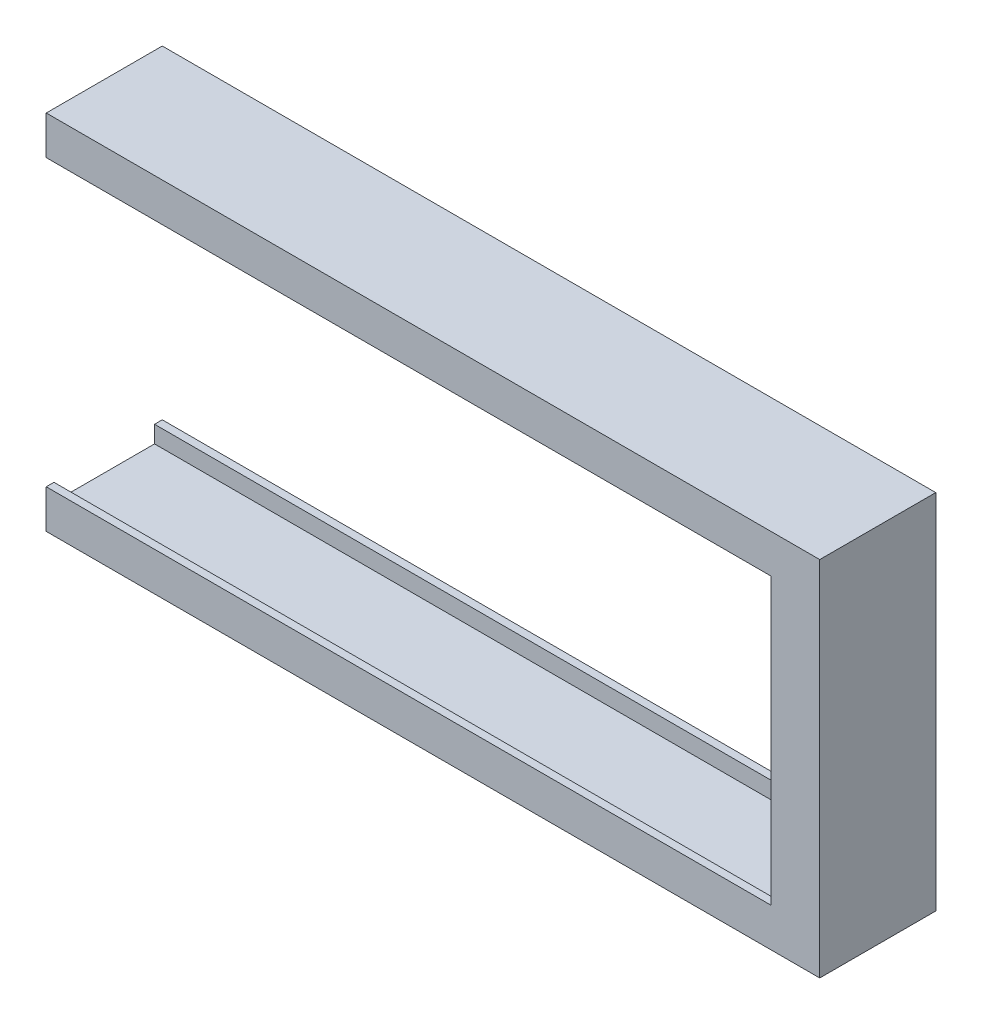
ISO-10303-21;
HEADER;
FILE_DESCRIPTION(('STEP AP214'),'2;1');
FILE_NAME('part.step','',(''),(''),'','','');
FILE_SCHEMA(('AUTOMOTIVE_DESIGN { 1 0 10303 214 1 1 1 1 }'));
ENDSEC;
DATA;
#1=APPLICATION_CONTEXT('core data for automotive mechanical design processes');
#2=APPLICATION_PROTOCOL_DEFINITION('international standard','automotive_design',2000,#1);
#3=PRODUCT_CONTEXT('',#1,'mechanical');
#4=PRODUCT('Part','Part','',(#3));
#5=PRODUCT_RELATED_PRODUCT_CATEGORY('part','',(#4));
#6=PRODUCT_DEFINITION_FORMATION('','',#4);
#7=PRODUCT_DEFINITION_CONTEXT('part definition',#1,'design');
#8=PRODUCT_DEFINITION('design','',#6,#7);
#9=PRODUCT_DEFINITION_SHAPE('','',#8);
#10=(LENGTH_UNIT() NAMED_UNIT(*) SI_UNIT(.MILLI.,.METRE.));
#11=(NAMED_UNIT(*) PLANE_ANGLE_UNIT() SI_UNIT($,.RADIAN.));
#12=(NAMED_UNIT(*) SI_UNIT($,.STERADIAN.) SOLID_ANGLE_UNIT());
#13=UNCERTAINTY_MEASURE_WITH_UNIT(LENGTH_MEASURE(1.E-05),#10,'distance_accuracy_value','');
#14=(GEOMETRIC_REPRESENTATION_CONTEXT(3) GLOBAL_UNCERTAINTY_ASSIGNED_CONTEXT((#13)) GLOBAL_UNIT_ASSIGNED_CONTEXT((#10,
#11,#12)) REPRESENTATION_CONTEXT('',''));
#15=CARTESIAN_POINT('',(0.,0.,0.));
#16=DIRECTION('',(0.,0.,1.));
#17=DIRECTION('',(1.,0.,0.));
#18=AXIS2_PLACEMENT_3D('',#15,#16,#17);
#19=CARTESIAN_POINT('',(-127.,-59.4995,-38.1));
#20=DIRECTION('',(-1.,0.,0.));
#21=DIRECTION('',(0.,0.,1.));
#22=AXIS2_PLACEMENT_3D('',#19,#20,#21);
#23=PLANE('',#22);
#24=DIRECTION('',(0.,0.,1.));
#25=VECTOR('',#24,1.);
#26=CARTESIAN_POINT('',(-127.,46.7995,-38.354));
#27=LINE('',#26,#25);
#28=CARTESIAN_POINT('',(-127.,46.7995,-2.54000000000001));
#29=VERTEX_POINT('',#28);
#30=CARTESIAN_POINT('',(-127.,46.7995,0.));
#31=VERTEX_POINT('',#30);
#32=EDGE_CURVE('E160',#29,#31,#27,.T.);
#33=ORIENTED_EDGE('',*,*,#32,.T.);
#34=DIRECTION('',(0.,-1.,0.));
#35=VECTOR('',#34,1.);
#36=CARTESIAN_POINT('',(-127.,-59.4995,0.));
#37=LINE('',#36,#35);
#38=CARTESIAN_POINT('',(-127.,59.4995,0.));
#39=VERTEX_POINT('',#38);
#40=EDGE_CURVE('E173',#39,#31,#37,.T.);
#41=ORIENTED_EDGE('',*,*,#40,.F.);
#42=DIRECTION('',(0.,0.,1.));
#43=VECTOR('',#42,1.);
#44=CARTESIAN_POINT('',(-127.,59.4995,-38.1));
#45=LINE('',#44,#43);
#46=CARTESIAN_POINT('',(-127.,59.4995,-38.1));
#47=VERTEX_POINT('',#46);
#48=EDGE_CURVE('E205',#47,#39,#45,.T.);
#49=ORIENTED_EDGE('',*,*,#48,.F.);
#50=DIRECTION('',(0.,-1.,0.));
#51=VECTOR('',#50,1.);
#52=CARTESIAN_POINT('',(-127.,-59.4995,-38.1));
#53=LINE('',#52,#51);
#54=CARTESIAN_POINT('',(-127.,46.7995,-38.1));
#55=VERTEX_POINT('',#54);
#56=EDGE_CURVE('E312',#47,#55,#53,.T.);
#57=ORIENTED_EDGE('',*,*,#56,.T.);
#58=CARTESIAN_POINT('',(-127.,46.7995,-35.56));
#59=VERTEX_POINT('',#58);
#60=EDGE_CURVE('E178',#55,#59,#27,.T.);
#61=ORIENTED_EDGE('',*,*,#60,.T.);
#62=DIRECTION('',(0.,-1.,0.));
#63=VECTOR('',#62,1.);
#64=CARTESIAN_POINT('',(-127.,52.3875,-35.56));
#65=LINE('',#64,#63);
#66=CARTESIAN_POINT('',(-127.,52.3875,-35.56));
#67=VERTEX_POINT('',#66);
#68=EDGE_CURVE('E276',#67,#59,#65,.T.);
#69=ORIENTED_EDGE('',*,*,#68,.F.);
#70=DIRECTION('',(0.,0.,-1.));
#71=VECTOR('',#70,1.);
#72=CARTESIAN_POINT('',(-127.,52.3875,-35.56));
#73=LINE('',#72,#71);
#74=CARTESIAN_POINT('',(-127.,52.3875,-2.54000000000001));
#75=VERTEX_POINT('',#74);
#76=EDGE_CURVE('E263',#75,#67,#73,.T.);
#77=ORIENTED_EDGE('',*,*,#76,.F.);
#78=DIRECTION('',(0.,1.,0.));
#79=VECTOR('',#78,1.);
#80=CARTESIAN_POINT('',(-127.,52.3875,-2.54000000000001));
#81=LINE('',#80,#79);
#82=EDGE_CURVE('E176',#29,#75,#81,.T.);
#83=ORIENTED_EDGE('',*,*,#82,.F.);
#84=EDGE_LOOP('',(#33,#41,#49,#57,#61,#69,#77,#83));
#85=FACE_BOUND('',#84,.T.);
#86=ADVANCED_FACE('F44',(#85),#23,.T.);
#87=CARTESIAN_POINT('',(127.,-59.4995,-38.1));
#88=DIRECTION('',(1.,0.,0.));
#89=DIRECTION('',(0.,0.,-1.));
#90=AXIS2_PLACEMENT_3D('',#87,#88,#89);
#91=PLANE('',#90);
#92=DIRECTION('',(0.,1.,0.));
#93=VECTOR('',#92,1.);
#94=CARTESIAN_POINT('',(127.,-59.4995,0.));
#95=LINE('',#94,#93);
#96=CARTESIAN_POINT('',(127.,-59.4995,0.));
#97=VERTEX_POINT('',#96);
#98=CARTESIAN_POINT('',(127.,59.4995,0.));
#99=VERTEX_POINT('',#98);
#100=EDGE_CURVE('E293',#97,#99,#95,.T.);
#101=ORIENTED_EDGE('',*,*,#100,.F.);
#102=DIRECTION('',(0.,0.,1.));
#103=VECTOR('',#102,1.);
#104=CARTESIAN_POINT('',(127.,-59.4995,-38.1));
#105=LINE('',#104,#103);
#106=CARTESIAN_POINT('',(127.,-59.4995,-38.1));
#107=VERTEX_POINT('',#106);
#108=EDGE_CURVE('E197',#107,#97,#105,.T.);
#109=ORIENTED_EDGE('',*,*,#108,.F.);
#110=DIRECTION('',(0.,1.,0.));
#111=VECTOR('',#110,1.);
#112=CARTESIAN_POINT('',(127.,-59.4995,-38.1));
#113=LINE('',#112,#111);
#114=CARTESIAN_POINT('',(127.,59.4995,-38.1));
#115=VERTEX_POINT('',#114);
#116=EDGE_CURVE('E192',#107,#115,#113,.T.);
#117=ORIENTED_EDGE('',*,*,#116,.T.);
#118=DIRECTION('',(0.,0.,1.));
#119=VECTOR('',#118,1.);
#120=CARTESIAN_POINT('',(127.,59.4995,-38.1));
#121=LINE('',#120,#119);
#122=EDGE_CURVE('E208',#115,#99,#121,.T.);
#123=ORIENTED_EDGE('',*,*,#122,.T.);
#124=EDGE_LOOP('',(#101,#109,#117,#123));
#125=FACE_BOUND('',#124,.T.);
#126=ADVANCED_FACE('F46',(#125),#91,.T.);
#127=CARTESIAN_POINT('',(-127.,-59.4995,-38.1));
#128=DIRECTION('',(0.,-1.,0.));
#129=DIRECTION('',(0.,0.,-1.));
#130=AXIS2_PLACEMENT_3D('',#127,#128,#129);
#131=PLANE('',#130);
#132=DIRECTION('',(1.,0.,0.));
#133=VECTOR('',#132,1.);
#134=CARTESIAN_POINT('',(-127.,-59.4995,0.));
#135=LINE('',#134,#133);
#136=CARTESIAN_POINT('',(-127.,-59.4995,0.));
#137=VERTEX_POINT('',#136);
#138=EDGE_CURVE('E186',#137,#97,#135,.T.);
#139=ORIENTED_EDGE('',*,*,#138,.F.);
#140=DIRECTION('',(0.,0.,1.));
#141=VECTOR('',#140,1.);
#142=CARTESIAN_POINT('',(-127.,-59.4995,-38.1));
#143=LINE('',#142,#141);
#144=CARTESIAN_POINT('',(-127.,-59.4995,-38.1));
#145=VERTEX_POINT('',#144);
#146=EDGE_CURVE('E201',#145,#137,#143,.T.);
#147=ORIENTED_EDGE('',*,*,#146,.F.);
#148=DIRECTION('',(1.,0.,0.));
#149=VECTOR('',#148,1.);
#150=CARTESIAN_POINT('',(-127.,-59.4995,-38.1));
#151=LINE('',#150,#149);
#152=EDGE_CURVE('E211',#145,#107,#151,.T.);
#153=ORIENTED_EDGE('',*,*,#152,.T.);
#154=ORIENTED_EDGE('',*,*,#108,.T.);
#155=EDGE_LOOP('',(#139,#147,#153,#154));
#156=FACE_BOUND('',#155,.T.);
#157=ADVANCED_FACE('F359',(#156),#131,.T.);
#158=DIRECTION('',(0.,0.,1.));
#159=VECTOR('',#158,1.);
#160=CARTESIAN_POINT('',(-127.,-46.7995,-38.354));
#161=LINE('',#160,#159);
#162=CARTESIAN_POINT('',(-127.,-46.7995,-38.1));
#163=VERTEX_POINT('',#162);
#164=CARTESIAN_POINT('',(-127.,-46.7995,-35.56));
#165=VERTEX_POINT('',#164);
#166=EDGE_CURVE('E60',#163,#165,#161,.T.);
#167=ORIENTED_EDGE('',*,*,#166,.F.);
#168=EDGE_CURVE('E311',#163,#145,#53,.T.);
#169=ORIENTED_EDGE('',*,*,#168,.T.);
#170=ORIENTED_EDGE('',*,*,#146,.T.);
#171=CARTESIAN_POINT('',(-127.,-46.7995,0.));
#172=VERTEX_POINT('',#171);
#173=EDGE_CURVE('E187',#172,#137,#37,.T.);
#174=ORIENTED_EDGE('',*,*,#173,.F.);
#175=CARTESIAN_POINT('',(-127.,-46.7995,-2.54000000000001));
#176=VERTEX_POINT('',#175);
#177=EDGE_CURVE('E235',#176,#172,#161,.T.);
#178=ORIENTED_EDGE('',*,*,#177,.F.);
#179=CARTESIAN_POINT('',(-127.,-52.3875,-2.54));
#180=VERTEX_POINT('',#179);
#181=EDGE_CURVE('E284',#180,#176,#81,.T.);
#182=ORIENTED_EDGE('',*,*,#181,.F.);
#183=DIRECTION('',(0.,0.,1.));
#184=VECTOR('',#183,1.);
#185=CARTESIAN_POINT('',(-127.,-52.3875,-35.56));
#186=LINE('',#185,#184);
#187=CARTESIAN_POINT('',(-127.,-52.3875,-35.56));
#188=VERTEX_POINT('',#187);
#189=EDGE_CURVE('E280',#188,#180,#186,.T.);
#190=ORIENTED_EDGE('',*,*,#189,.F.);
#191=EDGE_CURVE('E257',#165,#188,#65,.T.);
#192=ORIENTED_EDGE('',*,*,#191,.F.);
#193=EDGE_LOOP('',(#167,#169,#170,#174,#178,#182,#190,#192));
#194=FACE_BOUND('',#193,.T.);
#195=ADVANCED_FACE('F353',(#194),#23,.T.);
#196=CARTESIAN_POINT('',(-127.,59.4995,-38.1));
#197=DIRECTION('',(0.,1.,0.));
#198=DIRECTION('',(0.,0.,1.));
#199=AXIS2_PLACEMENT_3D('',#196,#197,#198);
#200=PLANE('',#199);
#201=DIRECTION('',(-1.,0.,0.));
#202=VECTOR('',#201,1.);
#203=CARTESIAN_POINT('',(-127.,59.4995,0.));
#204=LINE('',#203,#202);
#205=EDGE_CURVE('E184',#99,#39,#204,.T.);
#206=ORIENTED_EDGE('',*,*,#205,.F.);
#207=ORIENTED_EDGE('',*,*,#122,.F.);
#208=DIRECTION('',(-1.,0.,0.));
#209=VECTOR('',#208,1.);
#210=CARTESIAN_POINT('',(-127.,59.4995,-38.1));
#211=LINE('',#210,#209);
#212=EDGE_CURVE('E307',#115,#47,#211,.T.);
#213=ORIENTED_EDGE('',*,*,#212,.T.);
#214=ORIENTED_EDGE('',*,*,#48,.T.);
#215=EDGE_LOOP('',(#206,#207,#213,#214));
#216=FACE_BOUND('',#215,.T.);
#217=ADVANCED_FACE('F326',(#216),#200,.T.);
#218=CARTESIAN_POINT('',(0.,0.,-38.1));
#219=DIRECTION('',(0.,0.,-1.));
#220=DIRECTION('',(-1.,0.,0.));
#221=AXIS2_PLACEMENT_3D('',#218,#219,#220);
#222=PLANE('',#221);
#223=DIRECTION('',(1.,0.,0.));
#224=VECTOR('',#223,1.);
#225=CARTESIAN_POINT('',(0.,46.7995,-38.1));
#226=LINE('',#225,#224);
#227=CARTESIAN_POINT('',(111.01731175909,46.7995,-38.1));
#228=VERTEX_POINT('',#227);
#229=EDGE_CURVE('E254',#55,#228,#226,.T.);
#230=ORIENTED_EDGE('',*,*,#229,.F.);
#231=ORIENTED_EDGE('',*,*,#56,.F.);
#232=ORIENTED_EDGE('',*,*,#212,.F.);
#233=ORIENTED_EDGE('',*,*,#116,.F.);
#234=ORIENTED_EDGE('',*,*,#152,.F.);
#235=ORIENTED_EDGE('',*,*,#168,.F.);
#236=DIRECTION('',(-1.,0.,0.));
#237=VECTOR('',#236,1.);
#238=CARTESIAN_POINT('',(0.,-46.7995,-38.1));
#239=LINE('',#238,#237);
#240=CARTESIAN_POINT('',(111.01731175909,-46.7994999999999,-38.1));
#241=VERTEX_POINT('',#240);
#242=EDGE_CURVE('E240',#241,#163,#239,.T.);
#243=ORIENTED_EDGE('',*,*,#242,.F.);
#244=DIRECTION('',(0.,-1.,0.));
#245=VECTOR('',#244,1.);
#246=CARTESIAN_POINT('',(111.01731175909,0.,-38.1));
#247=LINE('',#246,#245);
#248=EDGE_CURVE('E247',#228,#241,#247,.T.);
#249=ORIENTED_EDGE('',*,*,#248,.F.);
#250=EDGE_LOOP('',(#230,#231,#232,#233,#234,#235,#243,#249));
#251=FACE_BOUND('',#250,.T.);
#252=ADVANCED_FACE('F331',(#251),#222,.T.);
#253=CARTESIAN_POINT('',(0.,0.,0.));
#254=DIRECTION('',(0.,0.,-1.));
#255=DIRECTION('',(-1.,0.,0.));
#256=AXIS2_PLACEMENT_3D('',#253,#254,#255);
#257=PLANE('',#256);
#258=ORIENTED_EDGE('',*,*,#40,.T.);
#259=DIRECTION('',(-1.,0.,0.));
#260=VECTOR('',#259,1.);
#261=CARTESIAN_POINT('',(111.01731175909,46.7995,0.));
#262=LINE('',#261,#260);
#263=CARTESIAN_POINT('',(111.01731175909,46.7995,0.));
#264=VERTEX_POINT('',#263);
#265=EDGE_CURVE('E157',#264,#31,#262,.T.);
#266=ORIENTED_EDGE('',*,*,#265,.F.);
#267=DIRECTION('',(0.,1.,0.));
#268=VECTOR('',#267,1.);
#269=CARTESIAN_POINT('',(111.01731175909,46.7995,0.));
#270=LINE('',#269,#268);
#271=CARTESIAN_POINT('',(111.01731175909,-46.7994999999999,0.));
#272=VERTEX_POINT('',#271);
#273=EDGE_CURVE('E179',#272,#264,#270,.T.);
#274=ORIENTED_EDGE('',*,*,#273,.F.);
#275=DIRECTION('',(1.,0.,0.));
#276=VECTOR('',#275,1.);
#277=CARTESIAN_POINT('',(111.01731175909,-46.7994999999999,0.));
#278=LINE('',#277,#276);
#279=EDGE_CURVE('E168',#172,#272,#278,.T.);
#280=ORIENTED_EDGE('',*,*,#279,.F.);
#281=ORIENTED_EDGE('',*,*,#173,.T.);
#282=ORIENTED_EDGE('',*,*,#138,.T.);
#283=ORIENTED_EDGE('',*,*,#100,.T.);
#284=ORIENTED_EDGE('',*,*,#205,.T.);
#285=EDGE_LOOP('',(#258,#266,#274,#280,#281,#282,#283,#284));
#286=FACE_BOUND('',#285,.T.);
#287=ADVANCED_FACE('F181',(#286),#257,.F.);
#288=CARTESIAN_POINT('',(114.3,52.3875,-35.56));
#289=DIRECTION('',(0.,0.,-1.));
#290=DIRECTION('',(0.,1.,0.));
#291=AXIS2_PLACEMENT_3D('',#288,#289,#290);
#292=PLANE('',#291);
#293=ORIENTED_EDGE('',*,*,#68,.T.);
#294=DIRECTION('',(1.,0.,0.));
#295=VECTOR('',#294,1.);
#296=CARTESIAN_POINT('',(114.3,46.7995,-35.56));
#297=LINE('',#296,#295);
#298=CARTESIAN_POINT('',(111.01731175909,46.7995,-35.56));
#299=VERTEX_POINT('',#298);
#300=EDGE_CURVE('E250',#59,#299,#297,.T.);
#301=ORIENTED_EDGE('',*,*,#300,.T.);
#302=DIRECTION('',(0.,-1.,0.));
#303=VECTOR('',#302,1.);
#304=CARTESIAN_POINT('',(111.01731175909,52.3875,-35.56));
#305=LINE('',#304,#303);
#306=CARTESIAN_POINT('',(111.01731175909,-46.7994999999999,-35.56));
#307=VERTEX_POINT('',#306);
#308=EDGE_CURVE('E243',#299,#307,#305,.T.);
#309=ORIENTED_EDGE('',*,*,#308,.T.);
#310=DIRECTION('',(-1.,0.,0.));
#311=VECTOR('',#310,1.);
#312=CARTESIAN_POINT('',(114.3,-46.7994999999999,-35.56));
#313=LINE('',#312,#311);
#314=EDGE_CURVE('E228',#307,#165,#313,.T.);
#315=ORIENTED_EDGE('',*,*,#314,.T.);
#316=ORIENTED_EDGE('',*,*,#191,.T.);
#317=DIRECTION('',(-1.,0.,0.));
#318=VECTOR('',#317,1.);
#319=CARTESIAN_POINT('',(114.3,-52.3875,-35.56));
#320=LINE('',#319,#318);
#321=CARTESIAN_POINT('',(114.3,-52.3875,-35.56));
#322=VERTEX_POINT('',#321);
#323=EDGE_CURVE('E275',#322,#188,#320,.T.);
#324=ORIENTED_EDGE('',*,*,#323,.F.);
#325=DIRECTION('',(0.,-1.,0.));
#326=VECTOR('',#325,1.);
#327=CARTESIAN_POINT('',(114.3,52.3875,-35.56));
#328=LINE('',#327,#326);
#329=CARTESIAN_POINT('',(114.3,52.3875,-35.56));
#330=VERTEX_POINT('',#329);
#331=EDGE_CURVE('E258',#330,#322,#328,.T.);
#332=ORIENTED_EDGE('',*,*,#331,.F.);
#333=DIRECTION('',(-1.,0.,0.));
#334=VECTOR('',#333,1.);
#335=CARTESIAN_POINT('',(114.3,52.3875,-35.56));
#336=LINE('',#335,#334);
#337=EDGE_CURVE('E290',#330,#67,#336,.T.);
#338=ORIENTED_EDGE('',*,*,#337,.T.);
#339=EDGE_LOOP('',(#293,#301,#309,#315,#316,#324,#332,#338));
#340=FACE_BOUND('',#339,.T.);
#341=ADVANCED_FACE('F341',(#340),#292,.F.);
#342=CARTESIAN_POINT('',(114.3,52.3875,-35.56));
#343=DIRECTION('',(0.,1.,0.));
#344=DIRECTION('',(0.,0.,1.));
#345=AXIS2_PLACEMENT_3D('',#342,#343,#344);
#346=PLANE('',#345);
#347=ORIENTED_EDGE('',*,*,#76,.T.);
#348=ORIENTED_EDGE('',*,*,#337,.F.);
#349=DIRECTION('',(0.,0.,-1.));
#350=VECTOR('',#349,1.);
#351=CARTESIAN_POINT('',(114.3,52.3875,-35.56));
#352=LINE('',#351,#350);
#353=CARTESIAN_POINT('',(114.3,52.3875,-2.54000000000001));
#354=VERTEX_POINT('',#353);
#355=EDGE_CURVE('E271',#354,#330,#352,.T.);
#356=ORIENTED_EDGE('',*,*,#355,.F.);
#357=DIRECTION('',(-1.,0.,0.));
#358=VECTOR('',#357,1.);
#359=CARTESIAN_POINT('',(114.3,52.3875,-2.54000000000001));
#360=LINE('',#359,#358);
#361=EDGE_CURVE('E294',#354,#75,#360,.T.);
#362=ORIENTED_EDGE('',*,*,#361,.T.);
#363=EDGE_LOOP('',(#347,#348,#356,#362));
#364=FACE_BOUND('',#363,.T.);
#365=ADVANCED_FACE('F368',(#364),#346,.F.);
#366=CARTESIAN_POINT('',(114.3,52.3875,-2.54000000000001));
#367=DIRECTION('',(0.,0.,1.));
#368=DIRECTION('',(0.,-1.,0.));
#369=AXIS2_PLACEMENT_3D('',#366,#367,#368);
#370=PLANE('',#369);
#371=DIRECTION('',(0.,1.,0.));
#372=VECTOR('',#371,1.);
#373=CARTESIAN_POINT('',(111.01731175909,52.3875,-2.54000000000001));
#374=LINE('',#373,#372);
#375=CARTESIAN_POINT('',(111.01731175909,-46.7994999999999,-2.54));
#376=VERTEX_POINT('',#375);
#377=CARTESIAN_POINT('',(111.01731175909,46.7995,-2.54000000000001));
#378=VERTEX_POINT('',#377);
#379=EDGE_CURVE('E53',#376,#378,#374,.T.);
#380=ORIENTED_EDGE('',*,*,#379,.T.);
#381=DIRECTION('',(-1.,0.,0.));
#382=VECTOR('',#381,1.);
#383=CARTESIAN_POINT('',(114.3,46.7995,-2.54000000000001));
#384=LINE('',#383,#382);
#385=EDGE_CURVE('E11',#378,#29,#384,.T.);
#386=ORIENTED_EDGE('',*,*,#385,.T.);
#387=ORIENTED_EDGE('',*,*,#82,.T.);
#388=ORIENTED_EDGE('',*,*,#361,.F.);
#389=DIRECTION('',(0.,1.,0.));
#390=VECTOR('',#389,1.);
#391=CARTESIAN_POINT('',(114.3,52.3875,-2.54000000000001));
#392=LINE('',#391,#390);
#393=CARTESIAN_POINT('',(114.3,-52.3875,-2.54));
#394=VERTEX_POINT('',#393);
#395=EDGE_CURVE('E267',#394,#354,#392,.T.);
#396=ORIENTED_EDGE('',*,*,#395,.F.);
#397=DIRECTION('',(-1.,0.,0.));
#398=VECTOR('',#397,1.);
#399=CARTESIAN_POINT('',(114.3,-52.3875,-2.54));
#400=LINE('',#399,#398);
#401=EDGE_CURVE('E298',#394,#180,#400,.T.);
#402=ORIENTED_EDGE('',*,*,#401,.T.);
#403=ORIENTED_EDGE('',*,*,#181,.T.);
#404=DIRECTION('',(1.,0.,0.));
#405=VECTOR('',#404,1.);
#406=CARTESIAN_POINT('',(114.3,-46.7994999999999,-2.54));
#407=LINE('',#406,#405);
#408=EDGE_CURVE('E200',#176,#376,#407,.T.);
#409=ORIENTED_EDGE('',*,*,#408,.T.);
#410=EDGE_LOOP('',(#380,#386,#387,#388,#396,#402,#403,#409));
#411=FACE_BOUND('',#410,.T.);
#412=ADVANCED_FACE('F217',(#411),#370,.F.);
#413=CARTESIAN_POINT('',(114.3,-52.3875,-35.56));
#414=DIRECTION('',(0.,-1.,0.));
#415=DIRECTION('',(0.,0.,-1.));
#416=AXIS2_PLACEMENT_3D('',#413,#414,#415);
#417=PLANE('',#416);
#418=ORIENTED_EDGE('',*,*,#189,.T.);
#419=ORIENTED_EDGE('',*,*,#401,.F.);
#420=DIRECTION('',(0.,0.,1.));
#421=VECTOR('',#420,1.);
#422=CARTESIAN_POINT('',(114.3,-52.3875,-35.56));
#423=LINE('',#422,#421);
#424=EDGE_CURVE('E262',#322,#394,#423,.T.);
#425=ORIENTED_EDGE('',*,*,#424,.F.);
#426=ORIENTED_EDGE('',*,*,#323,.T.);
#427=EDGE_LOOP('',(#418,#419,#425,#426));
#428=FACE_BOUND('',#427,.T.);
#429=ADVANCED_FACE('F374',(#428),#417,.F.);
#430=CARTESIAN_POINT('',(114.3,0.,0.));
#431=DIRECTION('',(-1.,0.,0.));
#432=DIRECTION('',(0.,0.,1.));
#433=AXIS2_PLACEMENT_3D('',#430,#431,#432);
#434=PLANE('',#433);
#435=ORIENTED_EDGE('',*,*,#331,.T.);
#436=ORIENTED_EDGE('',*,*,#424,.T.);
#437=ORIENTED_EDGE('',*,*,#395,.T.);
#438=ORIENTED_EDGE('',*,*,#355,.T.);
#439=EDGE_LOOP('',(#435,#436,#437,#438));
#440=FACE_BOUND('',#439,.T.);
#441=ADVANCED_FACE('F371',(#440),#434,.T.);
#442=CARTESIAN_POINT('',(111.01731175909,-46.7994999999999,-38.354));
#443=DIRECTION('',(0.,-1.,0.));
#444=DIRECTION('',(1.,0.,0.));
#445=AXIS2_PLACEMENT_3D('',#442,#443,#444);
#446=PLANE('',#445);
#447=ORIENTED_EDGE('',*,*,#177,.T.);
#448=ORIENTED_EDGE('',*,*,#279,.T.);
#449=DIRECTION('',(0.,0.,1.));
#450=VECTOR('',#449,1.);
#451=CARTESIAN_POINT('',(111.01731175909,-46.7994999999999,-38.354));
#452=LINE('',#451,#450);
#453=EDGE_CURVE('E68',#376,#272,#452,.T.);
#454=ORIENTED_EDGE('',*,*,#453,.F.);
#455=ORIENTED_EDGE('',*,*,#408,.F.);
#456=EDGE_LOOP('',(#447,#448,#454,#455));
#457=FACE_BOUND('',#456,.T.);
#458=ADVANCED_FACE('F349',(#457),#446,.F.);
#459=CARTESIAN_POINT('',(111.01731175909,46.7995,-38.354));
#460=DIRECTION('',(1.,0.,0.));
#461=DIRECTION('',(0.,1.,0.));
#462=AXIS2_PLACEMENT_3D('',#459,#460,#461);
#463=PLANE('',#462);
#464=ORIENTED_EDGE('',*,*,#453,.T.);
#465=ORIENTED_EDGE('',*,*,#273,.T.);
#466=DIRECTION('',(0.,0.,1.));
#467=VECTOR('',#466,1.);
#468=CARTESIAN_POINT('',(111.01731175909,46.7995,-38.354));
#469=LINE('',#468,#467);
#470=EDGE_CURVE('E162',#378,#264,#469,.T.);
#471=ORIENTED_EDGE('',*,*,#470,.F.);
#472=ORIENTED_EDGE('',*,*,#379,.F.);
#473=EDGE_LOOP('',(#464,#465,#471,#472));
#474=FACE_BOUND('',#473,.T.);
#475=ADVANCED_FACE('F220',(#474),#463,.F.);
#476=CARTESIAN_POINT('',(111.01731175909,46.7995,-38.354));
#477=DIRECTION('',(0.,1.,0.));
#478=DIRECTION('',(-1.,0.,0.));
#479=AXIS2_PLACEMENT_3D('',#476,#477,#478);
#480=PLANE('',#479);
#481=ORIENTED_EDGE('',*,*,#470,.T.);
#482=ORIENTED_EDGE('',*,*,#265,.T.);
#483=ORIENTED_EDGE('',*,*,#32,.F.);
#484=ORIENTED_EDGE('',*,*,#385,.F.);
#485=EDGE_LOOP('',(#481,#482,#483,#484));
#486=FACE_BOUND('',#485,.T.);
#487=ADVANCED_FACE('F159',(#486),#480,.F.);
#488=ORIENTED_EDGE('',*,*,#229,.T.);
#489=EDGE_CURVE('E222',#228,#299,#469,.T.);
#490=ORIENTED_EDGE('',*,*,#489,.T.);
#491=ORIENTED_EDGE('',*,*,#300,.F.);
#492=ORIENTED_EDGE('',*,*,#60,.F.);
#493=EDGE_LOOP('',(#488,#490,#491,#492));
#494=FACE_BOUND('',#493,.T.);
#495=ADVANCED_FACE('F336',(#494),#480,.F.);
#496=ORIENTED_EDGE('',*,*,#248,.T.);
#497=EDGE_CURVE('E223',#241,#307,#452,.T.);
#498=ORIENTED_EDGE('',*,*,#497,.T.);
#499=ORIENTED_EDGE('',*,*,#308,.F.);
#500=ORIENTED_EDGE('',*,*,#489,.F.);
#501=EDGE_LOOP('',(#496,#498,#499,#500));
#502=FACE_BOUND('',#501,.T.);
#503=ADVANCED_FACE('F338',(#502),#463,.F.);
#504=ORIENTED_EDGE('',*,*,#242,.T.);
#505=ORIENTED_EDGE('',*,*,#166,.T.);
#506=ORIENTED_EDGE('',*,*,#314,.F.);
#507=ORIENTED_EDGE('',*,*,#497,.F.);
#508=EDGE_LOOP('',(#504,#505,#506,#507));
#509=FACE_BOUND('',#508,.T.);
#510=ADVANCED_FACE('F361',(#509),#446,.F.);
#511=CLOSED_SHELL('',(#86,#126,#157,#195,#217,#252,#287,#341,#365,#412,#429,#441,#458,#475,#487,
#495,#503,#510));
#512=MANIFOLD_SOLID_BREP('B2',#511);
#513=ADVANCED_BREP_SHAPE_REPRESENTATION('',(#18,#512),#14);
#514=SHAPE_DEFINITION_REPRESENTATION(#9,#513);
ENDSEC;
END-ISO-10303-21;
